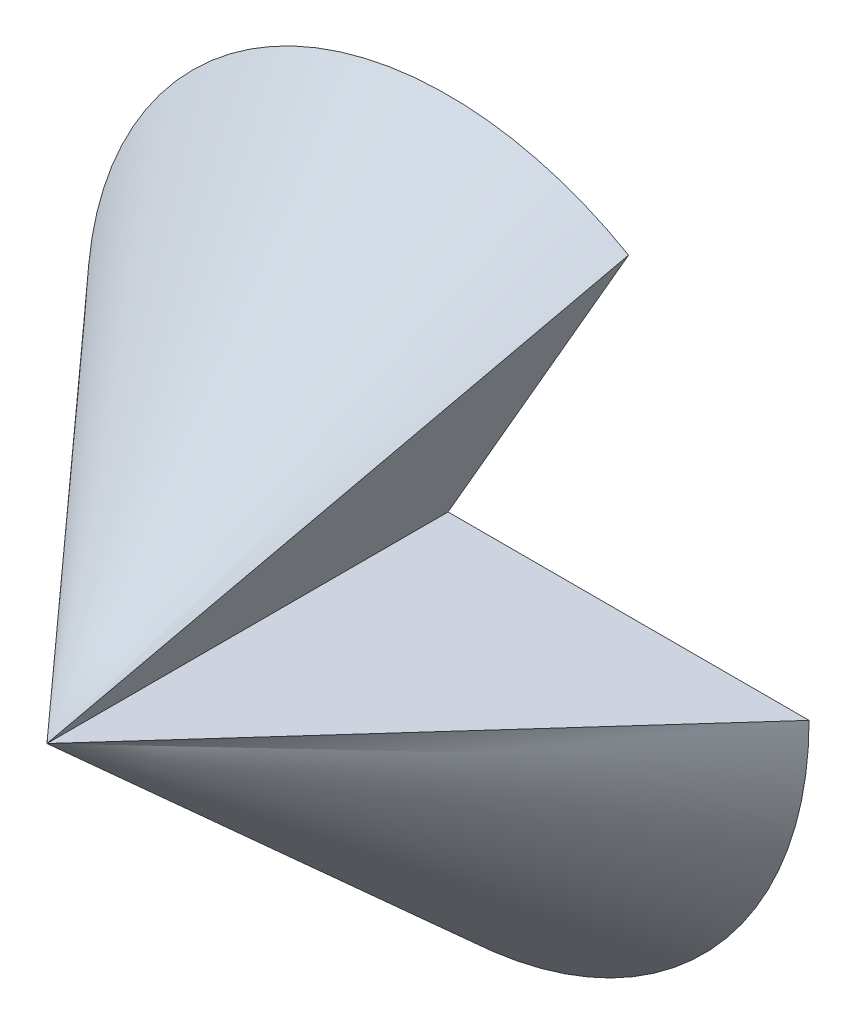
ISO-10303-21;
HEADER;
FILE_DESCRIPTION(('STEP AP214'),'2;1');
FILE_NAME('part.step','',(''),(''),'','','');
FILE_SCHEMA(('AUTOMOTIVE_DESIGN { 1 0 10303 214 1 1 1 1 }'));
ENDSEC;
DATA;
#1=APPLICATION_CONTEXT('core data for automotive mechanical design processes');
#2=APPLICATION_PROTOCOL_DEFINITION('international standard','automotive_design',2000,#1);
#3=PRODUCT_CONTEXT('',#1,'mechanical');
#4=PRODUCT('Part','Part','',(#3));
#5=PRODUCT_RELATED_PRODUCT_CATEGORY('part','',(#4));
#6=PRODUCT_DEFINITION_FORMATION('','',#4);
#7=PRODUCT_DEFINITION_CONTEXT('part definition',#1,'design');
#8=PRODUCT_DEFINITION('design','',#6,#7);
#9=PRODUCT_DEFINITION_SHAPE('','',#8);
#10=(LENGTH_UNIT() NAMED_UNIT(*) SI_UNIT(.MILLI.,.METRE.));
#11=(NAMED_UNIT(*) PLANE_ANGLE_UNIT() SI_UNIT($,.RADIAN.));
#12=(NAMED_UNIT(*) SI_UNIT($,.STERADIAN.) SOLID_ANGLE_UNIT());
#13=UNCERTAINTY_MEASURE_WITH_UNIT(LENGTH_MEASURE(1.E-05),#10,'distance_accuracy_value','');
#14=(GEOMETRIC_REPRESENTATION_CONTEXT(3) GLOBAL_UNCERTAINTY_ASSIGNED_CONTEXT((#13)) GLOBAL_UNIT_ASSIGNED_CONTEXT((#10,
#11,#12)) REPRESENTATION_CONTEXT('',''));
#15=CARTESIAN_POINT('',(0.,0.,0.));
#16=DIRECTION('',(0.,0.,1.));
#17=DIRECTION('',(1.,0.,0.));
#18=AXIS2_PLACEMENT_3D('',#15,#16,#17);
#19=CARTESIAN_POINT('',(0.,0.,0.));
#20=DIRECTION('',(0.,0.,-1.));
#21=DIRECTION('',(-1.,0.,0.));
#22=AXIS2_PLACEMENT_3D('',#19,#20,#21);
#23=PLANE('',#22);
#24=CARTESIAN_POINT('',(0.,0.,0.));
#25=DIRECTION('',(0.,0.,1.));
#26=DIRECTION('',(1.,0.,0.));
#27=AXIS2_PLACEMENT_3D('',#24,#25,#26);
#28=CIRCLE('',#27,45.);
#29=CARTESIAN_POINT('',(22.5000000000005,38.9711431702995,0.));
#30=VERTEX_POINT('',#29);
#31=CARTESIAN_POINT('',(45.,0.,0.));
#32=VERTEX_POINT('',#31);
#33=EDGE_CURVE('E11',#30,#32,#28,.T.);
#34=ORIENTED_EDGE('',*,*,#33,.F.);
#35=DIRECTION('',(-0.50000000000001,-0.866025403784433,0.));
#36=VECTOR('',#35,1.);
#37=CARTESIAN_POINT('',(0.,0.,0.));
#38=LINE('',#37,#36);
#39=CARTESIAN_POINT('',(0.,0.,0.));
#40=VERTEX_POINT('',#39);
#41=EDGE_CURVE('E40',#30,#40,#38,.T.);
#42=ORIENTED_EDGE('',*,*,#41,.T.);
#43=DIRECTION('',(-1.,0.,0.));
#44=VECTOR('',#43,1.);
#45=CARTESIAN_POINT('',(0.,0.,0.));
#46=LINE('',#45,#44);
#47=EDGE_CURVE('E47',#32,#40,#46,.T.);
#48=ORIENTED_EDGE('',*,*,#47,.F.);
#49=EDGE_LOOP('',(#34,#42,#48));
#50=FACE_BOUND('',#49,.T.);
#51=ADVANCED_FACE('F33',(#50),#23,.T.);
#52=CARTESIAN_POINT('',(0.,0.,50.));
#53=DIRECTION('',(0.,0.,-1.));
#54=DIRECTION('',(-1.,0.,0.));
#55=AXIS2_PLACEMENT_3D('',#52,#53,#54);
#56=CONICAL_SURFACE('',#55,0.,0.732815101786507);
#57=DIRECTION('',(0.334482365811232,0.579340451820877,-0.743294146247166));
#58=VECTOR('',#57,1.);
#59=CARTESIAN_POINT('',(22.5000000000005,38.9711431702995,0.));
#60=LINE('',#59,#58);
#61=CARTESIAN_POINT('',(0.,0.,50.));
#62=VERTEX_POINT('',#61);
#63=EDGE_CURVE('E61',#62,#30,#60,.T.);
#64=ORIENTED_EDGE('',*,*,#63,.T.);
#65=ORIENTED_EDGE('',*,*,#33,.T.);
#66=DIRECTION('',(0.66896473162245,0.,-0.743294146247166));
#67=VECTOR('',#66,1.);
#68=CARTESIAN_POINT('',(45.,0.,0.));
#69=LINE('',#68,#67);
#70=EDGE_CURVE('E59',#62,#32,#69,.T.);
#71=ORIENTED_EDGE('',*,*,#70,.F.);
#72=EDGE_LOOP('',(#64,#65,#71));
#73=FACE_BOUND('',#72,.T.);
#74=ADVANCED_FACE('F58',(#73),#56,.T.);
#75=CARTESIAN_POINT('',(0.,0.,0.));
#76=DIRECTION('',(0.866025403784433,-0.50000000000001,0.));
#77=DIRECTION('',(0.,0.,-1.));
#78=AXIS2_PLACEMENT_3D('',#75,#76,#77);
#79=PLANE('',#78);
#80=DIRECTION('',(0.,0.,1.));
#81=VECTOR('',#80,1.);
#82=CARTESIAN_POINT('',(0.,0.,50.));
#83=LINE('',#82,#81);
#84=EDGE_CURVE('E65',#40,#62,#83,.T.);
#85=ORIENTED_EDGE('',*,*,#84,.F.);
#86=ORIENTED_EDGE('',*,*,#41,.F.);
#87=ORIENTED_EDGE('',*,*,#63,.F.);
#88=EDGE_LOOP('',(#85,#86,#87));
#89=FACE_BOUND('',#88,.T.);
#90=ADVANCED_FACE('F71',(#89),#79,.T.);
#91=CARTESIAN_POINT('',(0.,0.,0.));
#92=DIRECTION('',(0.,-1.,0.));
#93=DIRECTION('',(0.,0.,-1.));
#94=AXIS2_PLACEMENT_3D('',#91,#92,#93);
#95=PLANE('',#94);
#96=ORIENTED_EDGE('',*,*,#84,.T.);
#97=ORIENTED_EDGE('',*,*,#70,.T.);
#98=ORIENTED_EDGE('',*,*,#47,.T.);
#99=EDGE_LOOP('',(#96,#97,#98));
#100=FACE_BOUND('',#99,.T.);
#101=ADVANCED_FACE('F63',(#100),#95,.F.);
#102=CLOSED_SHELL('',(#51,#74,#90,#101));
#103=MANIFOLD_SOLID_BREP('B2',#102);
#104=ADVANCED_BREP_SHAPE_REPRESENTATION('',(#18,#103),#14);
#105=SHAPE_DEFINITION_REPRESENTATION(#9,#104);
ENDSEC;
END-ISO-10303-21;
